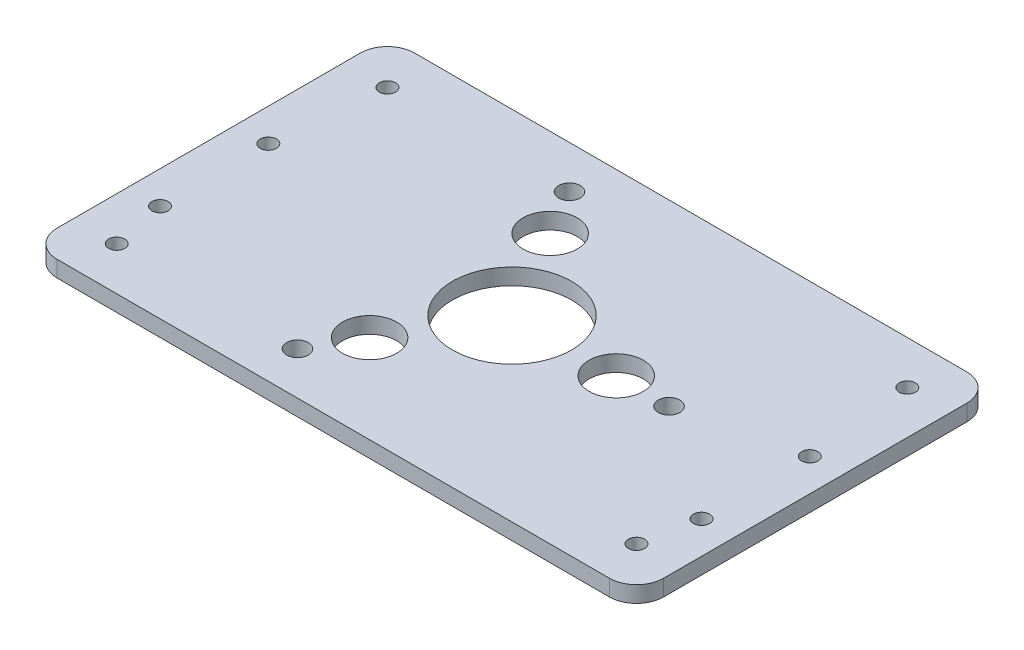
ISO-10303-21;
HEADER;
FILE_DESCRIPTION(('STEP AP214'),'2;1');
FILE_NAME('part.step','',(''),(''),'','','');
FILE_SCHEMA(('AUTOMOTIVE_DESIGN { 1 0 10303 214 1 1 1 1 }'));
ENDSEC;
DATA;
#1=APPLICATION_CONTEXT('core data for automotive mechanical design processes');
#2=APPLICATION_PROTOCOL_DEFINITION('international standard','automotive_design',2000,#1);
#3=PRODUCT_CONTEXT('',#1,'mechanical');
#4=PRODUCT('Part','Part','',(#3));
#5=PRODUCT_RELATED_PRODUCT_CATEGORY('part','',(#4));
#6=PRODUCT_DEFINITION_FORMATION('','',#4);
#7=PRODUCT_DEFINITION_CONTEXT('part definition',#1,'design');
#8=PRODUCT_DEFINITION('design','',#6,#7);
#9=PRODUCT_DEFINITION_SHAPE('','',#8);
#10=(LENGTH_UNIT() NAMED_UNIT(*) SI_UNIT(.MILLI.,.METRE.));
#11=(NAMED_UNIT(*) PLANE_ANGLE_UNIT() SI_UNIT($,.RADIAN.));
#12=(NAMED_UNIT(*) SI_UNIT($,.STERADIAN.) SOLID_ANGLE_UNIT());
#13=UNCERTAINTY_MEASURE_WITH_UNIT(LENGTH_MEASURE(1.E-05),#10,'distance_accuracy_value','');
#14=(GEOMETRIC_REPRESENTATION_CONTEXT(3) GLOBAL_UNCERTAINTY_ASSIGNED_CONTEXT((#13)) GLOBAL_UNIT_ASSIGNED_CONTEXT((#10,
#11,#12)) REPRESENTATION_CONTEXT('',''));
#15=CARTESIAN_POINT('',(0.,0.,0.));
#16=DIRECTION('',(0.,0.,1.));
#17=DIRECTION('',(1.,0.,0.));
#18=AXIS2_PLACEMENT_3D('',#15,#16,#17);
#19=CARTESIAN_POINT('',(0.,3.,0.));
#20=DIRECTION('',(0.,1.,0.));
#21=DIRECTION('',(0.,0.,1.));
#22=AXIS2_PLACEMENT_3D('',#19,#20,#21);
#23=PLANE('',#22);
#24=CARTESIAN_POINT('',(48.,3.,-25.));
#25=DIRECTION('',(0.,1.,0.));
#26=DIRECTION('',(0.,0.,-1.));
#27=AXIS2_PLACEMENT_3D('',#24,#25,#26);
#28=CIRCLE('',#27,1.50000000000001);
#29=CARTESIAN_POINT('',(48.,3.,-26.5));
#30=VERTEX_POINT('',#29);
#31=EDGE_CURVE('E521',#30,#30,#28,.T.);
#32=ORIENTED_EDGE('',*,*,#31,.F.);
#33=EDGE_LOOP('',(#32));
#34=FACE_BOUND('',#33,.T.);
#35=CARTESIAN_POINT('',(48.,3.,25.));
#36=DIRECTION('',(0.,1.,0.));
#37=DIRECTION('',(0.,0.,1.));
#38=AXIS2_PLACEMENT_3D('',#35,#36,#37);
#39=CIRCLE('',#38,1.50000000000001);
#40=CARTESIAN_POINT('',(48.,3.,26.5));
#41=VERTEX_POINT('',#40);
#42=EDGE_CURVE('E524',#41,#41,#39,.T.);
#43=ORIENTED_EDGE('',*,*,#42,.F.);
#44=EDGE_LOOP('',(#43));
#45=FACE_BOUND('',#44,.T.);
#46=CARTESIAN_POINT('',(-48.,3.,25.));
#47=DIRECTION('',(0.,1.,0.));
#48=DIRECTION('',(0.,0.,-1.));
#49=AXIS2_PLACEMENT_3D('',#46,#47,#48);
#50=CIRCLE('',#49,1.5);
#51=CARTESIAN_POINT('',(-48.,3.,23.5));
#52=VERTEX_POINT('',#51);
#53=EDGE_CURVE('E529',#52,#52,#50,.T.);
#54=ORIENTED_EDGE('',*,*,#53,.F.);
#55=EDGE_LOOP('',(#54));
#56=FACE_BOUND('',#55,.T.);
#57=CARTESIAN_POINT('',(-48.,3.,-25.));
#58=DIRECTION('',(0.,1.,0.));
#59=DIRECTION('',(0.,0.,1.));
#60=AXIS2_PLACEMENT_3D('',#57,#58,#59);
#61=CIRCLE('',#60,1.5);
#62=CARTESIAN_POINT('',(-48.,3.,-23.5));
#63=VERTEX_POINT('',#62);
#64=EDGE_CURVE('E180',#63,#63,#61,.T.);
#65=ORIENTED_EDGE('',*,*,#64,.F.);
#66=EDGE_LOOP('',(#65));
#67=FACE_BOUND('',#66,.T.);
#68=CARTESIAN_POINT('',(-9.625,3.,16.6709890228504));
#69=DIRECTION('',(0.,1.,0.));
#70=DIRECTION('',(0.,0.,1.));
#71=AXIS2_PLACEMENT_3D('',#68,#69,#70);
#72=CIRCLE('',#71,5.);
#73=CARTESIAN_POINT('',(-9.625,3.,21.6709890228504));
#74=VERTEX_POINT('',#73);
#75=EDGE_CURVE('E200',#74,#74,#72,.T.);
#76=ORIENTED_EDGE('',*,*,#75,.F.);
#77=EDGE_LOOP('',(#76));
#78=FACE_BOUND('',#77,.T.);
#79=CARTESIAN_POINT('',(19.25,3.,0.));
#80=DIRECTION('',(0.,1.,0.));
#81=DIRECTION('',(0.,0.,1.));
#82=AXIS2_PLACEMENT_3D('',#79,#80,#81);
#83=CIRCLE('',#82,5.);
#84=CARTESIAN_POINT('',(19.25,3.,5.));
#85=VERTEX_POINT('',#84);
#86=EDGE_CURVE('E209',#85,#85,#83,.T.);
#87=ORIENTED_EDGE('',*,*,#86,.F.);
#88=EDGE_LOOP('',(#87));
#89=FACE_BOUND('',#88,.T.);
#90=CARTESIAN_POINT('',(29.,3.,0.));
#91=DIRECTION('',(0.,1.,0.));
#92=DIRECTION('',(0.,0.,1.));
#93=AXIS2_PLACEMENT_3D('',#90,#91,#92);
#94=CIRCLE('',#93,2.);
#95=CARTESIAN_POINT('',(29.,3.,1.99999999999999));
#96=VERTEX_POINT('',#95);
#97=EDGE_CURVE('E222',#96,#96,#94,.T.);
#98=ORIENTED_EDGE('',*,*,#97,.F.);
#99=EDGE_LOOP('',(#98));
#100=FACE_BOUND('',#99,.T.);
#101=CARTESIAN_POINT('',(50.,3.,-5.));
#102=DIRECTION('',(0.,1.,0.));
#103=DIRECTION('',(0.,0.,-1.));
#104=AXIS2_PLACEMENT_3D('',#101,#102,#103);
#105=CIRCLE('',#104,1.5);
#106=CARTESIAN_POINT('',(50.,3.,-6.5));
#107=VERTEX_POINT('',#106);
#108=EDGE_CURVE('E231',#107,#107,#105,.T.);
#109=ORIENTED_EDGE('',*,*,#108,.F.);
#110=EDGE_LOOP('',(#109));
#111=FACE_BOUND('',#110,.T.);
#112=CARTESIAN_POINT('',(-50.,3.,15.));
#113=DIRECTION('',(0.,1.,0.));
#114=DIRECTION('',(0.,0.,-1.));
#115=AXIS2_PLACEMENT_3D('',#112,#113,#114);
#116=CIRCLE('',#115,1.5);
#117=CARTESIAN_POINT('',(-50.,3.,13.5));
#118=VERTEX_POINT('',#117);
#119=EDGE_CURVE('E244',#118,#118,#116,.T.);
#120=ORIENTED_EDGE('',*,*,#119,.F.);
#121=EDGE_LOOP('',(#120));
#122=FACE_BOUND('',#121,.T.);
#123=DIRECTION('',(1.,0.,0.));
#124=VECTOR('',#123,1.);
#125=CARTESIAN_POINT('',(-56.,3.,33.));
#126=LINE('',#125,#124);
#127=CARTESIAN_POINT('',(-51.,3.,33.));
#128=VERTEX_POINT('',#127);
#129=CARTESIAN_POINT('',(51.,3.,33.));
#130=VERTEX_POINT('',#129);
#131=EDGE_CURVE('E149',#128,#130,#126,.T.);
#132=ORIENTED_EDGE('',*,*,#131,.T.);
#133=CARTESIAN_POINT('',(51.,3.,28.));
#134=DIRECTION('',(0.,1.,0.));
#135=DIRECTION('',(0.,0.,1.));
#136=AXIS2_PLACEMENT_3D('',#133,#134,#135);
#137=CIRCLE('',#136,5.);
#138=CARTESIAN_POINT('',(56.,3.,28.));
#139=VERTEX_POINT('',#138);
#140=EDGE_CURVE('E164',#130,#139,#137,.T.);
#141=ORIENTED_EDGE('',*,*,#140,.T.);
#142=DIRECTION('',(0.,0.,-1.));
#143=VECTOR('',#142,1.);
#144=CARTESIAN_POINT('',(56.,3.,-33.));
#145=LINE('',#144,#143);
#146=CARTESIAN_POINT('',(56.,3.,-28.));
#147=VERTEX_POINT('',#146);
#148=EDGE_CURVE('E130',#139,#147,#145,.T.);
#149=ORIENTED_EDGE('',*,*,#148,.T.);
#150=CARTESIAN_POINT('',(51.,3.,-28.));
#151=DIRECTION('',(0.,1.,0.));
#152=DIRECTION('',(0.,0.,1.));
#153=AXIS2_PLACEMENT_3D('',#150,#151,#152);
#154=CIRCLE('',#153,5.);
#155=CARTESIAN_POINT('',(51.,3.,-33.));
#156=VERTEX_POINT('',#155);
#157=EDGE_CURVE('E162',#147,#156,#154,.T.);
#158=ORIENTED_EDGE('',*,*,#157,.T.);
#159=DIRECTION('',(-1.,0.,0.));
#160=VECTOR('',#159,1.);
#161=CARTESIAN_POINT('',(-56.,3.,-33.));
#162=LINE('',#161,#160);
#163=CARTESIAN_POINT('',(-51.,3.,-33.));
#164=VERTEX_POINT('',#163);
#165=EDGE_CURVE('E254',#156,#164,#162,.T.);
#166=ORIENTED_EDGE('',*,*,#165,.T.);
#167=CARTESIAN_POINT('',(-51.,3.,-28.));
#168=DIRECTION('',(0.,1.,0.));
#169=DIRECTION('',(0.,0.,1.));
#170=AXIS2_PLACEMENT_3D('',#167,#168,#169);
#171=CIRCLE('',#170,5.);
#172=CARTESIAN_POINT('',(-56.,3.,-28.));
#173=VERTEX_POINT('',#172);
#174=EDGE_CURVE('E61',#164,#173,#171,.T.);
#175=ORIENTED_EDGE('',*,*,#174,.T.);
#176=DIRECTION('',(0.,0.,1.));
#177=VECTOR('',#176,1.);
#178=CARTESIAN_POINT('',(-56.,3.,-33.));
#179=LINE('',#178,#177);
#180=CARTESIAN_POINT('',(-56.,3.,28.));
#181=VERTEX_POINT('',#180);
#182=EDGE_CURVE('E251',#173,#181,#179,.T.);
#183=ORIENTED_EDGE('',*,*,#182,.T.);
#184=CARTESIAN_POINT('',(-51.,3.,28.));
#185=DIRECTION('',(0.,1.,0.));
#186=DIRECTION('',(0.,0.,1.));
#187=AXIS2_PLACEMENT_3D('',#184,#185,#186);
#188=CIRCLE('',#187,5.);
#189=EDGE_CURVE('E158',#181,#128,#188,.T.);
#190=ORIENTED_EDGE('',*,*,#189,.T.);
#191=EDGE_LOOP('',(#132,#141,#149,#158,#166,#175,#183,#190));
#192=FACE_BOUND('',#191,.T.);
#193=CARTESIAN_POINT('',(-50.,3.,-5.00000000000001));
#194=DIRECTION('',(0.,1.,0.));
#195=DIRECTION('',(0.,0.,1.));
#196=AXIS2_PLACEMENT_3D('',#193,#194,#195);
#197=CIRCLE('',#196,1.5);
#198=CARTESIAN_POINT('',(-50.,3.,-3.50000000000001));
#199=VERTEX_POINT('',#198);
#200=EDGE_CURVE('E140',#199,#199,#197,.T.);
#201=ORIENTED_EDGE('',*,*,#200,.F.);
#202=EDGE_LOOP('',(#201));
#203=FACE_BOUND('',#202,.T.);
#204=CARTESIAN_POINT('',(50.,3.,15.));
#205=DIRECTION('',(0.,1.,0.));
#206=DIRECTION('',(0.,0.,1.));
#207=AXIS2_PLACEMENT_3D('',#204,#205,#206);
#208=CIRCLE('',#207,1.5);
#209=CARTESIAN_POINT('',(50.,3.,16.5));
#210=VERTEX_POINT('',#209);
#211=EDGE_CURVE('E237',#210,#210,#208,.T.);
#212=ORIENTED_EDGE('',*,*,#211,.F.);
#213=EDGE_LOOP('',(#212));
#214=FACE_BOUND('',#213,.T.);
#215=CARTESIAN_POINT('',(-14.5,3.,-25.1147367097487));
#216=DIRECTION('',(0.,1.,0.));
#217=DIRECTION('',(0.,0.,1.));
#218=AXIS2_PLACEMENT_3D('',#215,#216,#217);
#219=CIRCLE('',#218,2.);
#220=CARTESIAN_POINT('',(-14.5,3.,-23.1147367097487));
#221=VERTEX_POINT('',#220);
#222=EDGE_CURVE('E227',#221,#221,#219,.T.);
#223=ORIENTED_EDGE('',*,*,#222,.F.);
#224=EDGE_LOOP('',(#223));
#225=FACE_BOUND('',#224,.T.);
#226=CARTESIAN_POINT('',(-14.5,3.,25.1147367097487));
#227=DIRECTION('',(0.,1.,0.));
#228=DIRECTION('',(0.,0.,1.));
#229=AXIS2_PLACEMENT_3D('',#226,#227,#228);
#230=CIRCLE('',#229,2.);
#231=CARTESIAN_POINT('',(-14.5,3.,27.1147367097487));
#232=VERTEX_POINT('',#231);
#233=EDGE_CURVE('E211',#232,#232,#230,.T.);
#234=ORIENTED_EDGE('',*,*,#233,.F.);
#235=EDGE_LOOP('',(#234));
#236=FACE_BOUND('',#235,.T.);
#237=CARTESIAN_POINT('',(0.,3.,0.));
#238=DIRECTION('',(0.,1.,0.));
#239=DIRECTION('',(0.,0.,1.));
#240=AXIS2_PLACEMENT_3D('',#237,#238,#239);
#241=CIRCLE('',#240,11.);
#242=CARTESIAN_POINT('',(0.,3.,11.));
#243=VERTEX_POINT('',#242);
#244=EDGE_CURVE('E205',#243,#243,#241,.T.);
#245=ORIENTED_EDGE('',*,*,#244,.F.);
#246=EDGE_LOOP('',(#245));
#247=FACE_BOUND('',#246,.T.);
#248=CARTESIAN_POINT('',(-9.62500000000001,3.,-16.6709890228504));
#249=DIRECTION('',(0.,1.,0.));
#250=DIRECTION('',(0.,0.,1.));
#251=AXIS2_PLACEMENT_3D('',#248,#249,#250);
#252=CIRCLE('',#251,5.);
#253=CARTESIAN_POINT('',(-9.62500000000001,3.,-11.6709890228504));
#254=VERTEX_POINT('',#253);
#255=EDGE_CURVE('E189',#254,#254,#252,.T.);
#256=ORIENTED_EDGE('',*,*,#255,.F.);
#257=EDGE_LOOP('',(#256));
#258=FACE_BOUND('',#257,.T.);
#259=ADVANCED_FACE('F41',(#34,#45,#56,#67,#78,#89,#100,#111,#122,#192,#203,#214,#225,#236,#247,
#258),#23,.T.);
#260=CARTESIAN_POINT('',(0.,0.,0.));
#261=DIRECTION('',(0.,1.,0.));
#262=DIRECTION('',(0.,0.,1.));
#263=AXIS2_PLACEMENT_3D('',#260,#261,#262);
#264=PLANE('',#263);
#265=CARTESIAN_POINT('',(48.,0.,-25.));
#266=DIRECTION('',(0.,1.,0.));
#267=DIRECTION('',(0.,0.,1.));
#268=AXIS2_PLACEMENT_3D('',#265,#266,#267);
#269=CIRCLE('',#268,1.50000000000001);
#270=CARTESIAN_POINT('',(48.,0.,-23.5));
#271=VERTEX_POINT('',#270);
#272=EDGE_CURVE('E44',#271,#271,#269,.T.);
#273=ORIENTED_EDGE('',*,*,#272,.T.);
#274=EDGE_LOOP('',(#273));
#275=FACE_BOUND('',#274,.T.);
#276=CARTESIAN_POINT('',(48.,0.,25.));
#277=DIRECTION('',(0.,1.,0.));
#278=DIRECTION('',(0.,0.,1.));
#279=AXIS2_PLACEMENT_3D('',#276,#277,#278);
#280=CIRCLE('',#279,1.50000000000001);
#281=CARTESIAN_POINT('',(48.,0.,26.5));
#282=VERTEX_POINT('',#281);
#283=EDGE_CURVE('E177',#282,#282,#280,.T.);
#284=ORIENTED_EDGE('',*,*,#283,.T.);
#285=EDGE_LOOP('',(#284));
#286=FACE_BOUND('',#285,.T.);
#287=CARTESIAN_POINT('',(-48.,0.,25.));
#288=DIRECTION('',(0.,1.,0.));
#289=DIRECTION('',(0.,0.,1.));
#290=AXIS2_PLACEMENT_3D('',#287,#288,#289);
#291=CIRCLE('',#290,1.5);
#292=CARTESIAN_POINT('',(-48.,0.,26.5));
#293=VERTEX_POINT('',#292);
#294=EDGE_CURVE('E176',#293,#293,#291,.T.);
#295=ORIENTED_EDGE('',*,*,#294,.T.);
#296=EDGE_LOOP('',(#295));
#297=FACE_BOUND('',#296,.T.);
#298=CARTESIAN_POINT('',(-48.,0.,-25.));
#299=DIRECTION('',(0.,1.,0.));
#300=DIRECTION('',(0.,0.,1.));
#301=AXIS2_PLACEMENT_3D('',#298,#299,#300);
#302=CIRCLE('',#301,1.5);
#303=CARTESIAN_POINT('',(-48.,0.,-23.5));
#304=VERTEX_POINT('',#303);
#305=EDGE_CURVE('E173',#304,#304,#302,.T.);
#306=ORIENTED_EDGE('',*,*,#305,.T.);
#307=EDGE_LOOP('',(#306));
#308=FACE_BOUND('',#307,.T.);
#309=DIRECTION('',(0.,0.,-1.));
#310=VECTOR('',#309,1.);
#311=CARTESIAN_POINT('',(56.,0.,-33.));
#312=LINE('',#311,#310);
#313=CARTESIAN_POINT('',(56.,0.,28.));
#314=VERTEX_POINT('',#313);
#315=CARTESIAN_POINT('',(56.,0.,-28.));
#316=VERTEX_POINT('',#315);
#317=EDGE_CURVE('E128',#314,#316,#312,.T.);
#318=ORIENTED_EDGE('',*,*,#317,.F.);
#319=CARTESIAN_POINT('',(51.,0.,28.));
#320=DIRECTION('',(0.,1.,0.));
#321=DIRECTION('',(0.,0.,1.));
#322=AXIS2_PLACEMENT_3D('',#319,#320,#321);
#323=CIRCLE('',#322,5.);
#324=CARTESIAN_POINT('',(51.,0.,33.));
#325=VERTEX_POINT('',#324);
#326=EDGE_CURVE('E107',#314,#325,#323,.F.);
#327=ORIENTED_EDGE('',*,*,#326,.T.);
#328=DIRECTION('',(1.,0.,0.));
#329=VECTOR('',#328,1.);
#330=CARTESIAN_POINT('',(-56.,0.,33.));
#331=LINE('',#330,#329);
#332=CARTESIAN_POINT('',(-51.,0.,33.));
#333=VERTEX_POINT('',#332);
#334=EDGE_CURVE('E153',#333,#325,#331,.T.);
#335=ORIENTED_EDGE('',*,*,#334,.F.);
#336=CARTESIAN_POINT('',(-51.,0.,28.));
#337=DIRECTION('',(0.,1.,0.));
#338=DIRECTION('',(0.,0.,1.));
#339=AXIS2_PLACEMENT_3D('',#336,#337,#338);
#340=CIRCLE('',#339,5.);
#341=CARTESIAN_POINT('',(-56.,0.,28.));
#342=VERTEX_POINT('',#341);
#343=EDGE_CURVE('E126',#333,#342,#340,.F.);
#344=ORIENTED_EDGE('',*,*,#343,.T.);
#345=DIRECTION('',(0.,0.,1.));
#346=VECTOR('',#345,1.);
#347=CARTESIAN_POINT('',(-56.,0.,-33.));
#348=LINE('',#347,#346);
#349=CARTESIAN_POINT('',(-56.,0.,-28.));
#350=VERTEX_POINT('',#349);
#351=EDGE_CURVE('E142',#350,#342,#348,.T.);
#352=ORIENTED_EDGE('',*,*,#351,.F.);
#353=CARTESIAN_POINT('',(-51.,0.,-28.));
#354=DIRECTION('',(0.,1.,0.));
#355=DIRECTION('',(0.,0.,1.));
#356=AXIS2_PLACEMENT_3D('',#353,#354,#355);
#357=CIRCLE('',#356,5.);
#358=CARTESIAN_POINT('',(-51.,0.,-33.));
#359=VERTEX_POINT('',#358);
#360=EDGE_CURVE('E119',#350,#359,#357,.F.);
#361=ORIENTED_EDGE('',*,*,#360,.T.);
#362=DIRECTION('',(-1.,0.,0.));
#363=VECTOR('',#362,1.);
#364=CARTESIAN_POINT('',(-56.,0.,-33.));
#365=LINE('',#364,#363);
#366=CARTESIAN_POINT('',(51.,0.,-33.));
#367=VERTEX_POINT('',#366);
#368=EDGE_CURVE('E139',#367,#359,#365,.T.);
#369=ORIENTED_EDGE('',*,*,#368,.F.);
#370=CARTESIAN_POINT('',(51.,0.,-28.));
#371=DIRECTION('',(0.,1.,0.));
#372=DIRECTION('',(0.,0.,1.));
#373=AXIS2_PLACEMENT_3D('',#370,#371,#372);
#374=CIRCLE('',#373,5.);
#375=EDGE_CURVE('E137',#367,#316,#374,.F.);
#376=ORIENTED_EDGE('',*,*,#375,.T.);
#377=EDGE_LOOP('',(#318,#327,#335,#344,#352,#361,#369,#376));
#378=FACE_BOUND('',#377,.T.);
#379=CARTESIAN_POINT('',(-50.,0.,-5.00000000000001));
#380=DIRECTION('',(0.,1.,0.));
#381=DIRECTION('',(0.,0.,1.));
#382=AXIS2_PLACEMENT_3D('',#379,#380,#381);
#383=CIRCLE('',#382,1.5);
#384=CARTESIAN_POINT('',(-50.,0.,-3.50000000000001));
#385=VERTEX_POINT('',#384);
#386=EDGE_CURVE('E144',#385,#385,#383,.T.);
#387=ORIENTED_EDGE('',*,*,#386,.T.);
#388=EDGE_LOOP('',(#387));
#389=FACE_BOUND('',#388,.T.);
#390=CARTESIAN_POINT('',(-50.,0.,15.));
#391=DIRECTION('',(0.,1.,0.));
#392=DIRECTION('',(0.,0.,-1.));
#393=AXIS2_PLACEMENT_3D('',#390,#391,#392);
#394=CIRCLE('',#393,1.5);
#395=CARTESIAN_POINT('',(-50.,0.,13.5));
#396=VERTEX_POINT('',#395);
#397=EDGE_CURVE('E245',#396,#396,#394,.T.);
#398=ORIENTED_EDGE('',*,*,#397,.T.);
#399=EDGE_LOOP('',(#398));
#400=FACE_BOUND('',#399,.T.);
#401=CARTESIAN_POINT('',(50.,0.,15.));
#402=DIRECTION('',(0.,1.,0.));
#403=DIRECTION('',(0.,0.,1.));
#404=AXIS2_PLACEMENT_3D('',#401,#402,#403);
#405=CIRCLE('',#404,1.5);
#406=CARTESIAN_POINT('',(50.,0.,16.5));
#407=VERTEX_POINT('',#406);
#408=EDGE_CURVE('E236',#407,#407,#405,.T.);
#409=ORIENTED_EDGE('',*,*,#408,.T.);
#410=EDGE_LOOP('',(#409));
#411=FACE_BOUND('',#410,.T.);
#412=CARTESIAN_POINT('',(50.,0.,-5.));
#413=DIRECTION('',(0.,1.,0.));
#414=DIRECTION('',(0.,0.,-1.));
#415=AXIS2_PLACEMENT_3D('',#412,#413,#414);
#416=CIRCLE('',#415,1.5);
#417=CARTESIAN_POINT('',(50.,0.,-6.5));
#418=VERTEX_POINT('',#417);
#419=EDGE_CURVE('E229',#418,#418,#416,.T.);
#420=ORIENTED_EDGE('',*,*,#419,.T.);
#421=EDGE_LOOP('',(#420));
#422=FACE_BOUND('',#421,.T.);
#423=CARTESIAN_POINT('',(-14.5,0.,-25.1147367097487));
#424=DIRECTION('',(0.,1.,0.));
#425=DIRECTION('',(0.,0.,1.));
#426=AXIS2_PLACEMENT_3D('',#423,#424,#425);
#427=CIRCLE('',#426,2.);
#428=CARTESIAN_POINT('',(-14.5,0.,-23.1147367097487));
#429=VERTEX_POINT('',#428);
#430=EDGE_CURVE('E221',#429,#429,#427,.T.);
#431=ORIENTED_EDGE('',*,*,#430,.T.);
#432=EDGE_LOOP('',(#431));
#433=FACE_BOUND('',#432,.T.);
#434=CARTESIAN_POINT('',(29.,0.,0.));
#435=DIRECTION('',(0.,1.,0.));
#436=DIRECTION('',(0.,0.,1.));
#437=AXIS2_PLACEMENT_3D('',#434,#435,#436);
#438=CIRCLE('',#437,2.);
#439=CARTESIAN_POINT('',(29.,0.,1.99999999999999));
#440=VERTEX_POINT('',#439);
#441=EDGE_CURVE('E216',#440,#440,#438,.T.);
#442=ORIENTED_EDGE('',*,*,#441,.T.);
#443=EDGE_LOOP('',(#442));
#444=FACE_BOUND('',#443,.T.);
#445=CARTESIAN_POINT('',(-14.5,0.,25.1147367097487));
#446=DIRECTION('',(0.,1.,0.));
#447=DIRECTION('',(0.,0.,1.));
#448=AXIS2_PLACEMENT_3D('',#445,#446,#447);
#449=CIRCLE('',#448,2.);
#450=CARTESIAN_POINT('',(-14.5,0.,27.1147367097487));
#451=VERTEX_POINT('',#450);
#452=EDGE_CURVE('E214',#451,#451,#449,.T.);
#453=ORIENTED_EDGE('',*,*,#452,.T.);
#454=EDGE_LOOP('',(#453));
#455=FACE_BOUND('',#454,.T.);
#456=CARTESIAN_POINT('',(19.25,0.,0.));
#457=DIRECTION('',(0.,1.,0.));
#458=DIRECTION('',(0.,0.,1.));
#459=AXIS2_PLACEMENT_3D('',#456,#457,#458);
#460=CIRCLE('',#459,5.);
#461=CARTESIAN_POINT('',(19.25,0.,5.));
#462=VERTEX_POINT('',#461);
#463=EDGE_CURVE('E207',#462,#462,#460,.T.);
#464=ORIENTED_EDGE('',*,*,#463,.T.);
#465=EDGE_LOOP('',(#464));
#466=FACE_BOUND('',#465,.T.);
#467=CARTESIAN_POINT('',(0.,0.,0.));
#468=DIRECTION('',(0.,1.,0.));
#469=DIRECTION('',(0.,0.,1.));
#470=AXIS2_PLACEMENT_3D('',#467,#468,#469);
#471=CIRCLE('',#470,11.);
#472=CARTESIAN_POINT('',(0.,0.,11.));
#473=VERTEX_POINT('',#472);
#474=EDGE_CURVE('E197',#473,#473,#471,.T.);
#475=ORIENTED_EDGE('',*,*,#474,.T.);
#476=EDGE_LOOP('',(#475));
#477=FACE_BOUND('',#476,.T.);
#478=CARTESIAN_POINT('',(-9.625,0.,16.6709890228504));
#479=DIRECTION('',(0.,1.,0.));
#480=DIRECTION('',(0.,0.,1.));
#481=AXIS2_PLACEMENT_3D('',#478,#479,#480);
#482=CIRCLE('',#481,5.);
#483=CARTESIAN_POINT('',(-9.625,0.,21.6709890228504));
#484=VERTEX_POINT('',#483);
#485=EDGE_CURVE('E192',#484,#484,#482,.T.);
#486=ORIENTED_EDGE('',*,*,#485,.T.);
#487=EDGE_LOOP('',(#486));
#488=FACE_BOUND('',#487,.T.);
#489=CARTESIAN_POINT('',(-9.62500000000001,0.,-16.6709890228504));
#490=DIRECTION('',(0.,1.,0.));
#491=DIRECTION('',(0.,0.,1.));
#492=AXIS2_PLACEMENT_3D('',#489,#490,#491);
#493=CIRCLE('',#492,5.);
#494=CARTESIAN_POINT('',(-9.62500000000001,0.,-11.6709890228504));
#495=VERTEX_POINT('',#494);
#496=EDGE_CURVE('E183',#495,#495,#493,.T.);
#497=ORIENTED_EDGE('',*,*,#496,.T.);
#498=EDGE_LOOP('',(#497));
#499=FACE_BOUND('',#498,.T.);
#500=ADVANCED_FACE('F131',(#275,#286,#297,#308,#378,#389,#400,#411,#422,#433,#444,#455,#466,
#477,#488,#499),#264,.F.);
#501=CARTESIAN_POINT('',(56.,3.,-33.));
#502=DIRECTION('',(-1.,0.,0.));
#503=DIRECTION('',(0.,0.,1.));
#504=AXIS2_PLACEMENT_3D('',#501,#502,#503);
#505=PLANE('',#504);
#506=ORIENTED_EDGE('',*,*,#148,.F.);
#507=DIRECTION('',(0.,-1.,0.));
#508=VECTOR('',#507,1.);
#509=CARTESIAN_POINT('',(56.,3.,28.));
#510=LINE('',#509,#508);
#511=EDGE_CURVE('E113',#139,#314,#510,.T.);
#512=ORIENTED_EDGE('',*,*,#511,.T.);
#513=ORIENTED_EDGE('',*,*,#317,.T.);
#514=DIRECTION('',(0.,-1.,0.));
#515=VECTOR('',#514,1.);
#516=CARTESIAN_POINT('',(56.,3.,-28.));
#517=LINE('',#516,#515);
#518=EDGE_CURVE('E133',#316,#147,#517,.F.);
#519=ORIENTED_EDGE('',*,*,#518,.T.);
#520=EDGE_LOOP('',(#506,#512,#513,#519));
#521=FACE_BOUND('',#520,.T.);
#522=ADVANCED_FACE('F123',(#521),#505,.F.);
#523=CARTESIAN_POINT('',(-56.,3.,-33.));
#524=DIRECTION('',(0.,0.,1.));
#525=DIRECTION('',(1.,0.,0.));
#526=AXIS2_PLACEMENT_3D('',#523,#524,#525);
#527=PLANE('',#526);
#528=ORIENTED_EDGE('',*,*,#368,.T.);
#529=DIRECTION('',(0.,-1.,0.));
#530=VECTOR('',#529,1.);
#531=CARTESIAN_POINT('',(-51.,3.,-33.));
#532=LINE('',#531,#530);
#533=EDGE_CURVE('E11',#359,#164,#532,.F.);
#534=ORIENTED_EDGE('',*,*,#533,.T.);
#535=ORIENTED_EDGE('',*,*,#165,.F.);
#536=DIRECTION('',(0.,-1.,0.));
#537=VECTOR('',#536,1.);
#538=CARTESIAN_POINT('',(51.,3.,-33.));
#539=LINE('',#538,#537);
#540=EDGE_CURVE('E49',#156,#367,#539,.T.);
#541=ORIENTED_EDGE('',*,*,#540,.T.);
#542=EDGE_LOOP('',(#528,#534,#535,#541));
#543=FACE_BOUND('',#542,.T.);
#544=ADVANCED_FACE('F268',(#543),#527,.F.);
#545=CARTESIAN_POINT('',(-56.,3.,-33.));
#546=DIRECTION('',(1.,0.,0.));
#547=DIRECTION('',(0.,0.,-1.));
#548=AXIS2_PLACEMENT_3D('',#545,#546,#547);
#549=PLANE('',#548);
#550=ORIENTED_EDGE('',*,*,#182,.F.);
#551=DIRECTION('',(0.,-1.,0.));
#552=VECTOR('',#551,1.);
#553=CARTESIAN_POINT('',(-56.,3.,-28.));
#554=LINE('',#553,#552);
#555=EDGE_CURVE('E166',#173,#350,#554,.T.);
#556=ORIENTED_EDGE('',*,*,#555,.T.);
#557=ORIENTED_EDGE('',*,*,#351,.T.);
#558=DIRECTION('',(0.,-1.,0.));
#559=VECTOR('',#558,1.);
#560=CARTESIAN_POINT('',(-56.,3.,28.));
#561=LINE('',#560,#559);
#562=EDGE_CURVE('E59',#342,#181,#561,.F.);
#563=ORIENTED_EDGE('',*,*,#562,.T.);
#564=EDGE_LOOP('',(#550,#556,#557,#563));
#565=FACE_BOUND('',#564,.T.);
#566=ADVANCED_FACE('F264',(#565),#549,.F.);
#567=CARTESIAN_POINT('',(-56.,3.,33.));
#568=DIRECTION('',(0.,0.,-1.));
#569=DIRECTION('',(-1.,0.,0.));
#570=AXIS2_PLACEMENT_3D('',#567,#568,#569);
#571=PLANE('',#570);
#572=ORIENTED_EDGE('',*,*,#334,.T.);
#573=DIRECTION('',(0.,-1.,0.));
#574=VECTOR('',#573,1.);
#575=CARTESIAN_POINT('',(51.,3.,33.));
#576=LINE('',#575,#574);
#577=EDGE_CURVE('E112',#325,#130,#576,.F.);
#578=ORIENTED_EDGE('',*,*,#577,.T.);
#579=ORIENTED_EDGE('',*,*,#131,.F.);
#580=DIRECTION('',(0.,-1.,0.));
#581=VECTOR('',#580,1.);
#582=CARTESIAN_POINT('',(-51.,3.,33.));
#583=LINE('',#582,#581);
#584=EDGE_CURVE('E118',#128,#333,#583,.T.);
#585=ORIENTED_EDGE('',*,*,#584,.T.);
#586=EDGE_LOOP('',(#572,#578,#579,#585));
#587=FACE_BOUND('',#586,.T.);
#588=ADVANCED_FACE('F263',(#587),#571,.F.);
#589=CARTESIAN_POINT('',(-50.,3.,-5.00000000000001));
#590=DIRECTION('',(0.,-1.,0.));
#591=DIRECTION('',(0.,0.,-1.));
#592=AXIS2_PLACEMENT_3D('',#589,#590,#591);
#593=CYLINDRICAL_SURFACE('',#592,1.5);
#594=ORIENTED_EDGE('',*,*,#200,.T.);
#595=EDGE_LOOP('',(#594));
#596=FACE_BOUND('',#595,.T.);
#597=ORIENTED_EDGE('',*,*,#386,.F.);
#598=EDGE_LOOP('',(#597));
#599=FACE_BOUND('',#598,.T.);
#600=ADVANCED_FACE('F291',(#596,#599),#593,.F.);
#601=CARTESIAN_POINT('',(-50.,3.,15.));
#602=DIRECTION('',(0.,-1.,0.));
#603=DIRECTION('',(0.,0.,-1.));
#604=AXIS2_PLACEMENT_3D('',#601,#602,#603);
#605=CYLINDRICAL_SURFACE('',#604,1.5);
#606=ORIENTED_EDGE('',*,*,#119,.T.);
#607=EDGE_LOOP('',(#606));
#608=FACE_BOUND('',#607,.T.);
#609=ORIENTED_EDGE('',*,*,#397,.F.);
#610=EDGE_LOOP('',(#609));
#611=FACE_BOUND('',#610,.T.);
#612=ADVANCED_FACE('F350',(#608,#611),#605,.F.);
#613=CARTESIAN_POINT('',(50.,3.,15.));
#614=DIRECTION('',(0.,-1.,0.));
#615=DIRECTION('',(0.,0.,-1.));
#616=AXIS2_PLACEMENT_3D('',#613,#614,#615);
#617=CYLINDRICAL_SURFACE('',#616,1.5);
#618=ORIENTED_EDGE('',*,*,#211,.T.);
#619=EDGE_LOOP('',(#618));
#620=FACE_BOUND('',#619,.T.);
#621=ORIENTED_EDGE('',*,*,#408,.F.);
#622=EDGE_LOOP('',(#621));
#623=FACE_BOUND('',#622,.T.);
#624=ADVANCED_FACE('F345',(#620,#623),#617,.F.);
#625=CARTESIAN_POINT('',(50.,3.,-5.));
#626=DIRECTION('',(0.,-1.,0.));
#627=DIRECTION('',(0.,0.,-1.));
#628=AXIS2_PLACEMENT_3D('',#625,#626,#627);
#629=CYLINDRICAL_SURFACE('',#628,1.5);
#630=ORIENTED_EDGE('',*,*,#108,.T.);
#631=EDGE_LOOP('',(#630));
#632=FACE_BOUND('',#631,.T.);
#633=ORIENTED_EDGE('',*,*,#419,.F.);
#634=EDGE_LOOP('',(#633));
#635=FACE_BOUND('',#634,.T.);
#636=ADVANCED_FACE('F338',(#632,#635),#629,.F.);
#637=CARTESIAN_POINT('',(-14.5,3.,-25.1147367097487));
#638=DIRECTION('',(0.,-1.,0.));
#639=DIRECTION('',(0.,0.,-1.));
#640=AXIS2_PLACEMENT_3D('',#637,#638,#639);
#641=CYLINDRICAL_SURFACE('',#640,2.);
#642=ORIENTED_EDGE('',*,*,#222,.T.);
#643=EDGE_LOOP('',(#642));
#644=FACE_BOUND('',#643,.T.);
#645=ORIENTED_EDGE('',*,*,#430,.F.);
#646=EDGE_LOOP('',(#645));
#647=FACE_BOUND('',#646,.T.);
#648=ADVANCED_FACE('F337',(#644,#647),#641,.F.);
#649=CARTESIAN_POINT('',(29.,3.,0.));
#650=DIRECTION('',(0.,-1.,0.));
#651=DIRECTION('',(0.,0.,-1.));
#652=AXIS2_PLACEMENT_3D('',#649,#650,#651);
#653=CYLINDRICAL_SURFACE('',#652,2.);
#654=ORIENTED_EDGE('',*,*,#97,.T.);
#655=EDGE_LOOP('',(#654));
#656=FACE_BOUND('',#655,.T.);
#657=ORIENTED_EDGE('',*,*,#441,.F.);
#658=EDGE_LOOP('',(#657));
#659=FACE_BOUND('',#658,.T.);
#660=ADVANCED_FACE('F334',(#656,#659),#653,.F.);
#661=CARTESIAN_POINT('',(-14.5,3.,25.1147367097487));
#662=DIRECTION('',(0.,-1.,0.));
#663=DIRECTION('',(0.,0.,-1.));
#664=AXIS2_PLACEMENT_3D('',#661,#662,#663);
#665=CYLINDRICAL_SURFACE('',#664,2.);
#666=ORIENTED_EDGE('',*,*,#233,.T.);
#667=EDGE_LOOP('',(#666));
#668=FACE_BOUND('',#667,.T.);
#669=ORIENTED_EDGE('',*,*,#452,.F.);
#670=EDGE_LOOP('',(#669));
#671=FACE_BOUND('',#670,.T.);
#672=ADVANCED_FACE('F326',(#668,#671),#665,.F.);
#673=CARTESIAN_POINT('',(19.25,3.,0.));
#674=DIRECTION('',(0.,-1.,0.));
#675=DIRECTION('',(0.,0.,-1.));
#676=AXIS2_PLACEMENT_3D('',#673,#674,#675);
#677=CYLINDRICAL_SURFACE('',#676,5.);
#678=ORIENTED_EDGE('',*,*,#86,.T.);
#679=EDGE_LOOP('',(#678));
#680=FACE_BOUND('',#679,.T.);
#681=ORIENTED_EDGE('',*,*,#463,.F.);
#682=EDGE_LOOP('',(#681));
#683=FACE_BOUND('',#682,.T.);
#684=ADVANCED_FACE('F325',(#680,#683),#677,.F.);
#685=CARTESIAN_POINT('',(0.,3.,0.));
#686=DIRECTION('',(0.,-1.,0.));
#687=DIRECTION('',(0.,0.,-1.));
#688=AXIS2_PLACEMENT_3D('',#685,#686,#687);
#689=CYLINDRICAL_SURFACE('',#688,11.);
#690=ORIENTED_EDGE('',*,*,#244,.T.);
#691=EDGE_LOOP('',(#690));
#692=FACE_BOUND('',#691,.T.);
#693=ORIENTED_EDGE('',*,*,#474,.F.);
#694=EDGE_LOOP('',(#693));
#695=FACE_BOUND('',#694,.T.);
#696=ADVANCED_FACE('F314',(#692,#695),#689,.F.);
#697=CARTESIAN_POINT('',(-9.625,3.,16.6709890228504));
#698=DIRECTION('',(0.,-1.,0.));
#699=DIRECTION('',(0.,0.,-1.));
#700=AXIS2_PLACEMENT_3D('',#697,#698,#699);
#701=CYLINDRICAL_SURFACE('',#700,5.);
#702=ORIENTED_EDGE('',*,*,#75,.T.);
#703=EDGE_LOOP('',(#702));
#704=FACE_BOUND('',#703,.T.);
#705=ORIENTED_EDGE('',*,*,#485,.F.);
#706=EDGE_LOOP('',(#705));
#707=FACE_BOUND('',#706,.T.);
#708=ADVANCED_FACE('F307',(#704,#707),#701,.F.);
#709=CARTESIAN_POINT('',(-9.62500000000001,3.,-16.6709890228504));
#710=DIRECTION('',(0.,-1.,0.));
#711=DIRECTION('',(0.,0.,-1.));
#712=AXIS2_PLACEMENT_3D('',#709,#710,#711);
#713=CYLINDRICAL_SURFACE('',#712,5.);
#714=ORIENTED_EDGE('',*,*,#255,.T.);
#715=EDGE_LOOP('',(#714));
#716=FACE_BOUND('',#715,.T.);
#717=ORIENTED_EDGE('',*,*,#496,.F.);
#718=EDGE_LOOP('',(#717));
#719=FACE_BOUND('',#718,.T.);
#720=ADVANCED_FACE('F304',(#716,#719),#713,.F.);
#721=CARTESIAN_POINT('',(51.,3.,28.));
#722=DIRECTION('',(0.,-1.,0.));
#723=DIRECTION('',(0.,0.,-1.));
#724=AXIS2_PLACEMENT_3D('',#721,#722,#723);
#725=CYLINDRICAL_SURFACE('',#724,5.);
#726=ORIENTED_EDGE('',*,*,#140,.F.);
#727=ORIENTED_EDGE('',*,*,#577,.F.);
#728=ORIENTED_EDGE('',*,*,#326,.F.);
#729=ORIENTED_EDGE('',*,*,#511,.F.);
#730=EDGE_LOOP('',(#726,#727,#728,#729));
#731=FACE_BOUND('',#730,.T.);
#732=ADVANCED_FACE('F115',(#731),#725,.T.);
#733=CARTESIAN_POINT('',(-51.,3.,-28.));
#734=DIRECTION('',(0.,-1.,0.));
#735=DIRECTION('',(0.,0.,-1.));
#736=AXIS2_PLACEMENT_3D('',#733,#734,#735);
#737=CYLINDRICAL_SURFACE('',#736,5.);
#738=ORIENTED_EDGE('',*,*,#174,.F.);
#739=ORIENTED_EDGE('',*,*,#533,.F.);
#740=ORIENTED_EDGE('',*,*,#360,.F.);
#741=ORIENTED_EDGE('',*,*,#555,.F.);
#742=EDGE_LOOP('',(#738,#739,#740,#741));
#743=FACE_BOUND('',#742,.T.);
#744=ADVANCED_FACE('F269',(#743),#737,.T.);
#745=CARTESIAN_POINT('',(51.,3.,-28.));
#746=DIRECTION('',(0.,-1.,0.));
#747=DIRECTION('',(0.,0.,-1.));
#748=AXIS2_PLACEMENT_3D('',#745,#746,#747);
#749=CYLINDRICAL_SURFACE('',#748,5.);
#750=ORIENTED_EDGE('',*,*,#157,.F.);
#751=ORIENTED_EDGE('',*,*,#518,.F.);
#752=ORIENTED_EDGE('',*,*,#375,.F.);
#753=ORIENTED_EDGE('',*,*,#540,.F.);
#754=EDGE_LOOP('',(#750,#751,#752,#753));
#755=FACE_BOUND('',#754,.T.);
#756=ADVANCED_FACE('F273',(#755),#749,.T.);
#757=CARTESIAN_POINT('',(-51.,3.,28.));
#758=DIRECTION('',(0.,-1.,0.));
#759=DIRECTION('',(0.,0.,-1.));
#760=AXIS2_PLACEMENT_3D('',#757,#758,#759);
#761=CYLINDRICAL_SURFACE('',#760,5.);
#762=ORIENTED_EDGE('',*,*,#189,.F.);
#763=ORIENTED_EDGE('',*,*,#562,.F.);
#764=ORIENTED_EDGE('',*,*,#343,.F.);
#765=ORIENTED_EDGE('',*,*,#584,.F.);
#766=EDGE_LOOP('',(#762,#763,#764,#765));
#767=FACE_BOUND('',#766,.T.);
#768=ADVANCED_FACE('F43',(#767),#761,.T.);
#769=CARTESIAN_POINT('',(-48.,-7.,-25.));
#770=DIRECTION('',(0.,1.,0.));
#771=DIRECTION('',(0.,0.,1.));
#772=AXIS2_PLACEMENT_3D('',#769,#770,#771);
#773=CYLINDRICAL_SURFACE('',#772,1.5);
#774=ORIENTED_EDGE('',*,*,#64,.T.);
#775=EDGE_LOOP('',(#774));
#776=FACE_BOUND('',#775,.T.);
#777=ORIENTED_EDGE('',*,*,#305,.F.);
#778=EDGE_LOOP('',(#777));
#779=FACE_BOUND('',#778,.T.);
#780=ADVANCED_FACE('F283',(#776,#779),#773,.F.);
#781=CARTESIAN_POINT('',(-48.,-7.,25.));
#782=DIRECTION('',(0.,1.,0.));
#783=DIRECTION('',(0.,0.,1.));
#784=AXIS2_PLACEMENT_3D('',#781,#782,#783);
#785=CYLINDRICAL_SURFACE('',#784,1.5);
#786=ORIENTED_EDGE('',*,*,#53,.T.);
#787=EDGE_LOOP('',(#786));
#788=FACE_BOUND('',#787,.T.);
#789=ORIENTED_EDGE('',*,*,#294,.F.);
#790=EDGE_LOOP('',(#789));
#791=FACE_BOUND('',#790,.T.);
#792=ADVANCED_FACE('F489',(#788,#791),#785,.F.);
#793=CARTESIAN_POINT('',(48.,-7.,25.));
#794=DIRECTION('',(0.,1.,0.));
#795=DIRECTION('',(0.,0.,1.));
#796=AXIS2_PLACEMENT_3D('',#793,#794,#795);
#797=CYLINDRICAL_SURFACE('',#796,1.50000000000001);
#798=ORIENTED_EDGE('',*,*,#42,.T.);
#799=EDGE_LOOP('',(#798));
#800=FACE_BOUND('',#799,.T.);
#801=ORIENTED_EDGE('',*,*,#283,.F.);
#802=EDGE_LOOP('',(#801));
#803=FACE_BOUND('',#802,.T.);
#804=ADVANCED_FACE('F497',(#800,#803),#797,.F.);
#805=CARTESIAN_POINT('',(48.,-7.,-25.));
#806=DIRECTION('',(0.,1.,0.));
#807=DIRECTION('',(0.,0.,1.));
#808=AXIS2_PLACEMENT_3D('',#805,#806,#807);
#809=CYLINDRICAL_SURFACE('',#808,1.50000000000001);
#810=ORIENTED_EDGE('',*,*,#31,.T.);
#811=EDGE_LOOP('',(#810));
#812=FACE_BOUND('',#811,.T.);
#813=ORIENTED_EDGE('',*,*,#272,.F.);
#814=EDGE_LOOP('',(#813));
#815=FACE_BOUND('',#814,.T.);
#816=ADVANCED_FACE('F508',(#812,#815),#809,.F.);
#817=CLOSED_SHELL('',(#259,#500,#522,#544,#566,#588,#600,#612,#624,#636,#648,#660,#672,#684,
#696,#708,#720,#732,#744,#756,#768,#780,#792,#804,#816));
#818=MANIFOLD_SOLID_BREP('B2',#817);
#819=ADVANCED_BREP_SHAPE_REPRESENTATION('',(#18,#818),#14);
#820=SHAPE_DEFINITION_REPRESENTATION(#9,#819);
ENDSEC;
END-ISO-10303-21;
